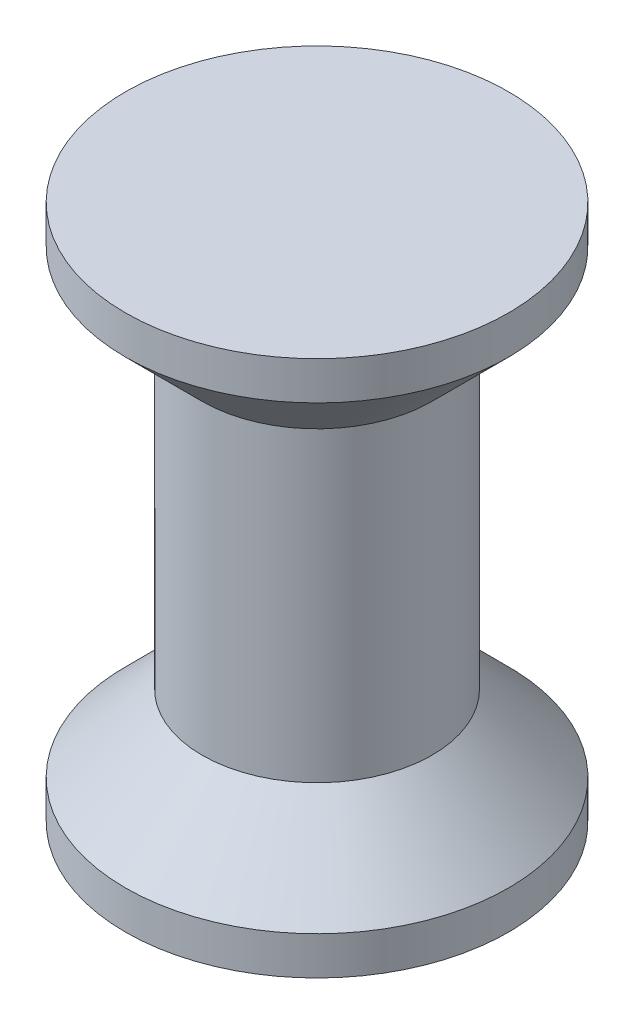
ISO-10303-21;
HEADER;
FILE_DESCRIPTION(('STEP AP214'),'2;1');
FILE_NAME('part.step','',(''),(''),'','','');
FILE_SCHEMA(('AUTOMOTIVE_DESIGN { 1 0 10303 214 1 1 1 1 }'));
ENDSEC;
DATA;
#1=APPLICATION_CONTEXT('core data for automotive mechanical design processes');
#2=APPLICATION_PROTOCOL_DEFINITION('international standard','automotive_design',2000,#1);
#3=PRODUCT_CONTEXT('',#1,'mechanical');
#4=PRODUCT('Part','Part','',(#3));
#5=PRODUCT_RELATED_PRODUCT_CATEGORY('part','',(#4));
#6=PRODUCT_DEFINITION_FORMATION('','',#4);
#7=PRODUCT_DEFINITION_CONTEXT('part definition',#1,'design');
#8=PRODUCT_DEFINITION('design','',#6,#7);
#9=PRODUCT_DEFINITION_SHAPE('','',#8);
#10=(LENGTH_UNIT() NAMED_UNIT(*) SI_UNIT(.MILLI.,.METRE.));
#11=(NAMED_UNIT(*) PLANE_ANGLE_UNIT() SI_UNIT($,.RADIAN.));
#12=(NAMED_UNIT(*) SI_UNIT($,.STERADIAN.) SOLID_ANGLE_UNIT());
#13=UNCERTAINTY_MEASURE_WITH_UNIT(LENGTH_MEASURE(1.E-05),#10,'distance_accuracy_value','');
#14=(GEOMETRIC_REPRESENTATION_CONTEXT(3) GLOBAL_UNCERTAINTY_ASSIGNED_CONTEXT((#13)) GLOBAL_UNIT_ASSIGNED_CONTEXT((#10,
#11,#12)) REPRESENTATION_CONTEXT('',''));
#15=CARTESIAN_POINT('',(0.,0.,0.));
#16=DIRECTION('',(0.,0.,1.));
#17=DIRECTION('',(1.,0.,0.));
#18=AXIS2_PLACEMENT_3D('',#15,#16,#17);
#19=CARTESIAN_POINT('',(0.,-35.,0.));
#20=DIRECTION('',(0.,1.,0.));
#21=DIRECTION('',(0.,0.,1.));
#22=AXIS2_PLACEMENT_3D('',#19,#20,#21);
#23=PLANE('',#22);
#24=CARTESIAN_POINT('',(0.,-35.,0.));
#25=DIRECTION('',(0.,1.,0.));
#26=DIRECTION('',(0.,0.,1.));
#27=AXIS2_PLACEMENT_3D('',#24,#25,#26);
#28=CIRCLE('',#27,25.);
#29=CARTESIAN_POINT('',(0.,-35.,25.));
#30=VERTEX_POINT('',#29);
#31=EDGE_CURVE('E10',#30,#30,#28,.T.);
#32=ORIENTED_EDGE('',*,*,#31,.F.);
#33=EDGE_LOOP('',(#32));
#34=FACE_BOUND('',#33,.T.);
#35=ADVANCED_FACE('F33',(#34),#23,.F.);
#36=CARTESIAN_POINT('',(0.,35.,0.));
#37=DIRECTION('',(0.,1.,0.));
#38=DIRECTION('',(0.,0.,1.));
#39=AXIS2_PLACEMENT_3D('',#36,#37,#38);
#40=CYLINDRICAL_SURFACE('',#39,25.);
#41=CARTESIAN_POINT('',(0.,-30.,0.));
#42=DIRECTION('',(0.,1.,0.));
#43=DIRECTION('',(0.,0.,1.));
#44=AXIS2_PLACEMENT_3D('',#41,#42,#43);
#45=CIRCLE('',#44,25.);
#46=CARTESIAN_POINT('',(0.,-30.,25.));
#47=VERTEX_POINT('',#46);
#48=EDGE_CURVE('E39',#47,#47,#45,.T.);
#49=ORIENTED_EDGE('',*,*,#48,.F.);
#50=EDGE_LOOP('',(#49));
#51=FACE_BOUND('',#50,.T.);
#52=ORIENTED_EDGE('',*,*,#31,.T.);
#53=EDGE_LOOP('',(#52));
#54=FACE_BOUND('',#53,.T.);
#55=ADVANCED_FACE('F81',(#51,#54),#40,.T.);
#56=CARTESIAN_POINT('',(0.,-30.,0.));
#57=DIRECTION('',(0.,-1.,0.));
#58=DIRECTION('',(0.,0.,-1.));
#59=AXIS2_PLACEMENT_3D('',#56,#57,#58);
#60=CONICAL_SURFACE('',#59,25.,0.785398163397448);
#61=CARTESIAN_POINT('',(0.,-20.,0.));
#62=DIRECTION('',(0.,1.,0.));
#63=DIRECTION('',(0.,0.,1.));
#64=AXIS2_PLACEMENT_3D('',#61,#62,#63);
#65=CIRCLE('',#64,15.);
#66=CARTESIAN_POINT('',(0.,-20.,15.));
#67=VERTEX_POINT('',#66);
#68=EDGE_CURVE('E43',#67,#67,#65,.T.);
#69=ORIENTED_EDGE('',*,*,#68,.F.);
#70=EDGE_LOOP('',(#69));
#71=FACE_BOUND('',#70,.T.);
#72=ORIENTED_EDGE('',*,*,#48,.T.);
#73=EDGE_LOOP('',(#72));
#74=FACE_BOUND('',#73,.T.);
#75=ADVANCED_FACE('F76',(#71,#74),#60,.T.);
#76=CARTESIAN_POINT('',(0.,35.,0.));
#77=DIRECTION('',(0.,1.,0.));
#78=DIRECTION('',(0.,0.,1.));
#79=AXIS2_PLACEMENT_3D('',#76,#77,#78);
#80=CYLINDRICAL_SURFACE('',#79,15.);
#81=CARTESIAN_POINT('',(0.,20.,0.));
#82=DIRECTION('',(0.,1.,0.));
#83=DIRECTION('',(0.,0.,1.));
#84=AXIS2_PLACEMENT_3D('',#81,#82,#83);
#85=CIRCLE('',#84,15.);
#86=CARTESIAN_POINT('',(0.,20.,15.));
#87=VERTEX_POINT('',#86);
#88=EDGE_CURVE('E47',#87,#87,#85,.T.);
#89=ORIENTED_EDGE('',*,*,#88,.F.);
#90=EDGE_LOOP('',(#89));
#91=FACE_BOUND('',#90,.T.);
#92=ORIENTED_EDGE('',*,*,#68,.T.);
#93=EDGE_LOOP('',(#92));
#94=FACE_BOUND('',#93,.T.);
#95=ADVANCED_FACE('F70',(#91,#94),#80,.T.);
#96=CARTESIAN_POINT('',(0.,20.,0.));
#97=DIRECTION('',(0.,1.,0.));
#98=DIRECTION('',(0.,0.,1.));
#99=AXIS2_PLACEMENT_3D('',#96,#97,#98);
#100=CONICAL_SURFACE('',#99,15.,0.785398163397448);
#101=CARTESIAN_POINT('',(0.,30.,0.));
#102=DIRECTION('',(0.,1.,0.));
#103=DIRECTION('',(0.,0.,1.));
#104=AXIS2_PLACEMENT_3D('',#101,#102,#103);
#105=CIRCLE('',#104,25.);
#106=CARTESIAN_POINT('',(0.,30.,25.));
#107=VERTEX_POINT('',#106);
#108=EDGE_CURVE('E52',#107,#107,#105,.T.);
#109=ORIENTED_EDGE('',*,*,#108,.F.);
#110=EDGE_LOOP('',(#109));
#111=FACE_BOUND('',#110,.T.);
#112=ORIENTED_EDGE('',*,*,#88,.T.);
#113=EDGE_LOOP('',(#112));
#114=FACE_BOUND('',#113,.T.);
#115=ADVANCED_FACE('F64',(#111,#114),#100,.T.);
#116=CARTESIAN_POINT('',(0.,35.,0.));
#117=DIRECTION('',(0.,1.,0.));
#118=DIRECTION('',(0.,0.,1.));
#119=AXIS2_PLACEMENT_3D('',#116,#117,#118);
#120=CYLINDRICAL_SURFACE('',#119,25.);
#121=CARTESIAN_POINT('',(0.,35.,0.));
#122=DIRECTION('',(0.,1.,0.));
#123=DIRECTION('',(0.,0.,1.));
#124=AXIS2_PLACEMENT_3D('',#121,#122,#123);
#125=CIRCLE('',#124,25.);
#126=CARTESIAN_POINT('',(0.,35.,25.));
#127=VERTEX_POINT('',#126);
#128=EDGE_CURVE('E55',#127,#127,#125,.T.);
#129=ORIENTED_EDGE('',*,*,#128,.F.);
#130=EDGE_LOOP('',(#129));
#131=FACE_BOUND('',#130,.T.);
#132=ORIENTED_EDGE('',*,*,#108,.T.);
#133=EDGE_LOOP('',(#132));
#134=FACE_BOUND('',#133,.T.);
#135=ADVANCED_FACE('F61',(#131,#134),#120,.T.);
#136=CARTESIAN_POINT('',(0.,35.,0.));
#137=DIRECTION('',(0.,-1.,0.));
#138=DIRECTION('',(0.,0.,-1.));
#139=AXIS2_PLACEMENT_3D('',#136,#137,#138);
#140=PLANE('',#139);
#141=ORIENTED_EDGE('',*,*,#128,.T.);
#142=EDGE_LOOP('',(#141));
#143=FACE_BOUND('',#142,.T.);
#144=ADVANCED_FACE('F59',(#143),#140,.F.);
#145=CLOSED_SHELL('',(#35,#55,#75,#95,#115,#135,#144));
#146=MANIFOLD_SOLID_BREP('B2',#145);
#147=ADVANCED_BREP_SHAPE_REPRESENTATION('',(#18,#146),#14);
#148=SHAPE_DEFINITION_REPRESENTATION(#9,#147);
ENDSEC;
END-ISO-10303-21;
